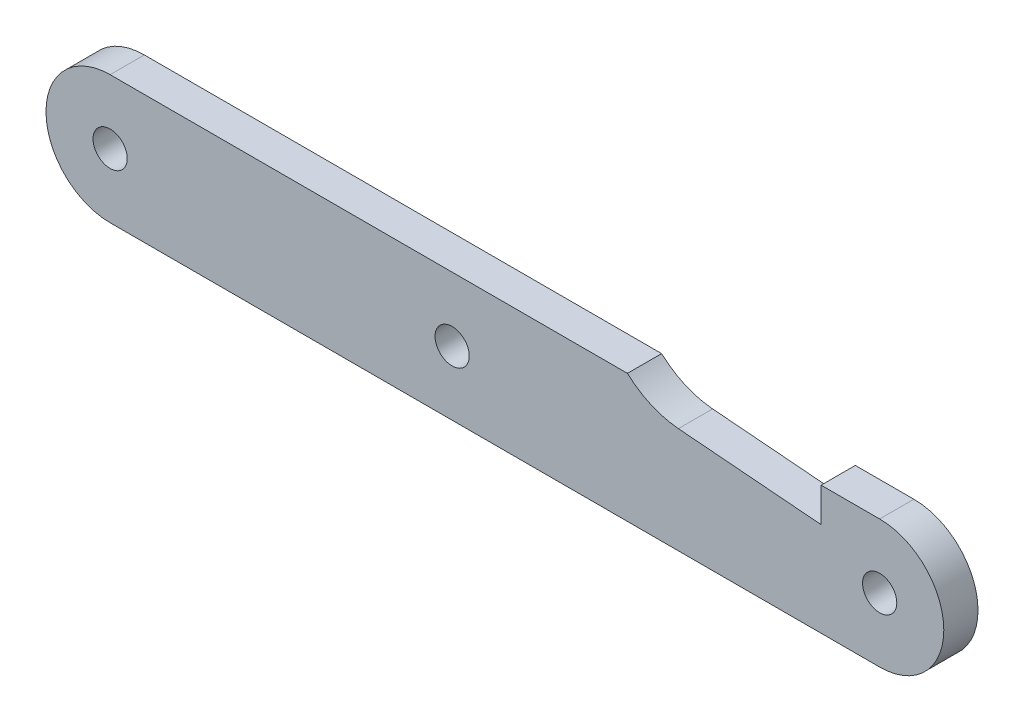
ISO-10303-21;
HEADER;
FILE_DESCRIPTION(('STEP AP214'),'2;1');
FILE_NAME('part.step','',(''),(''),'','','');
FILE_SCHEMA(('AUTOMOTIVE_DESIGN { 1 0 10303 214 1 1 1 1 }'));
ENDSEC;
DATA;
#1=APPLICATION_CONTEXT('core data for automotive mechanical design processes');
#2=APPLICATION_PROTOCOL_DEFINITION('international standard','automotive_design',2000,#1);
#3=PRODUCT_CONTEXT('',#1,'mechanical');
#4=PRODUCT('Part','Part','',(#3));
#5=PRODUCT_RELATED_PRODUCT_CATEGORY('part','',(#4));
#6=PRODUCT_DEFINITION_FORMATION('','',#4);
#7=PRODUCT_DEFINITION_CONTEXT('part definition',#1,'design');
#8=PRODUCT_DEFINITION('design','',#6,#7);
#9=PRODUCT_DEFINITION_SHAPE('','',#8);
#10=(LENGTH_UNIT() NAMED_UNIT(*) SI_UNIT(.MILLI.,.METRE.));
#11=(NAMED_UNIT(*) PLANE_ANGLE_UNIT() SI_UNIT($,.RADIAN.));
#12=(NAMED_UNIT(*) SI_UNIT($,.STERADIAN.) SOLID_ANGLE_UNIT());
#13=UNCERTAINTY_MEASURE_WITH_UNIT(LENGTH_MEASURE(1.E-05),#10,'distance_accuracy_value','');
#14=(GEOMETRIC_REPRESENTATION_CONTEXT(3) GLOBAL_UNCERTAINTY_ASSIGNED_CONTEXT((#13)) GLOBAL_UNIT_ASSIGNED_CONTEXT((#10,
#11,#12)) REPRESENTATION_CONTEXT('',''));
#15=CARTESIAN_POINT('',(0.,0.,0.));
#16=DIRECTION('',(0.,0.,1.));
#17=DIRECTION('',(1.,0.,0.));
#18=AXIS2_PLACEMENT_3D('',#15,#16,#17);
#19=CARTESIAN_POINT('',(0.,-7.5,4.));
#20=DIRECTION('',(0.,1.,0.));
#21=DIRECTION('',(0.,0.,1.));
#22=AXIS2_PLACEMENT_3D('',#19,#20,#21);
#23=PLANE('',#22);
#24=DIRECTION('',(1.,0.,0.));
#25=VECTOR('',#24,1.);
#26=CARTESIAN_POINT('',(0.,-7.5,0.));
#27=LINE('',#26,#25);
#28=CARTESIAN_POINT('',(0.,-7.5,0.));
#29=VERTEX_POINT('',#28);
#30=CARTESIAN_POINT('',(90.,-7.5,0.));
#31=VERTEX_POINT('',#30);
#32=EDGE_CURVE('E127',#29,#31,#27,.T.);
#33=ORIENTED_EDGE('',*,*,#32,.T.);
#34=DIRECTION('',(0.,0.,-1.));
#35=VECTOR('',#34,1.);
#36=CARTESIAN_POINT('',(90.,-7.5,4.));
#37=LINE('',#36,#35);
#38=CARTESIAN_POINT('',(90.,-7.5,4.));
#39=VERTEX_POINT('',#38);
#40=EDGE_CURVE('E107',#39,#31,#37,.T.);
#41=ORIENTED_EDGE('',*,*,#40,.F.);
#42=DIRECTION('',(1.,0.,0.));
#43=VECTOR('',#42,1.);
#44=CARTESIAN_POINT('',(0.,-7.5,4.));
#45=LINE('',#44,#43);
#46=CARTESIAN_POINT('',(0.,-7.5,4.));
#47=VERTEX_POINT('',#46);
#48=EDGE_CURVE('E114',#47,#39,#45,.T.);
#49=ORIENTED_EDGE('',*,*,#48,.F.);
#50=DIRECTION('',(0.,0.,-1.));
#51=VECTOR('',#50,1.);
#52=CARTESIAN_POINT('',(0.,-7.5,4.));
#53=LINE('',#52,#51);
#54=EDGE_CURVE('E141',#47,#29,#53,.T.);
#55=ORIENTED_EDGE('',*,*,#54,.T.);
#56=EDGE_LOOP('',(#33,#41,#49,#55));
#57=FACE_BOUND('',#56,.T.);
#58=ADVANCED_FACE('F37',(#57),#23,.F.);
#59=CARTESIAN_POINT('',(90.,0.,4.));
#60=DIRECTION('',(0.,0.,-1.));
#61=DIRECTION('',(-1.,0.,0.));
#62=AXIS2_PLACEMENT_3D('',#59,#60,#61);
#63=CYLINDRICAL_SURFACE('',#62,7.5);
#64=CARTESIAN_POINT('',(90.,0.,0.));
#65=DIRECTION('',(0.,0.,1.));
#66=DIRECTION('',(1.,0.,0.));
#67=AXIS2_PLACEMENT_3D('',#64,#65,#66);
#68=CIRCLE('',#67,7.5);
#69=CARTESIAN_POINT('',(90.,7.5,0.));
#70=VERTEX_POINT('',#69);
#71=EDGE_CURVE('E156',#31,#70,#68,.T.);
#72=ORIENTED_EDGE('',*,*,#71,.T.);
#73=DIRECTION('',(0.,0.,-1.));
#74=VECTOR('',#73,1.);
#75=CARTESIAN_POINT('',(90.,7.5,4.));
#76=LINE('',#75,#74);
#77=CARTESIAN_POINT('',(90.,7.5,4.));
#78=VERTEX_POINT('',#77);
#79=EDGE_CURVE('E109',#78,#70,#76,.T.);
#80=ORIENTED_EDGE('',*,*,#79,.F.);
#81=CARTESIAN_POINT('',(90.,0.,4.));
#82=DIRECTION('',(0.,0.,1.));
#83=DIRECTION('',(1.,0.,0.));
#84=AXIS2_PLACEMENT_3D('',#81,#82,#83);
#85=CIRCLE('',#84,7.5);
#86=EDGE_CURVE('E102',#39,#78,#85,.T.);
#87=ORIENTED_EDGE('',*,*,#86,.F.);
#88=ORIENTED_EDGE('',*,*,#40,.T.);
#89=EDGE_LOOP('',(#72,#80,#87,#88));
#90=FACE_BOUND('',#89,.T.);
#91=ADVANCED_FACE('F105',(#90),#63,.T.);
#92=CARTESIAN_POINT('',(0.,7.49999999999999,4.));
#93=DIRECTION('',(0.,1.,0.));
#94=DIRECTION('',(-1.,0.,0.));
#95=AXIS2_PLACEMENT_3D('',#92,#93,#94);
#96=PLANE('',#95);
#97=DIRECTION('',(1.,0.,0.));
#98=VECTOR('',#97,1.);
#99=CARTESIAN_POINT('',(0.,7.49999999999999,0.));
#100=LINE('',#99,#98);
#101=CARTESIAN_POINT('',(83.1517129679241,7.5,0.));
#102=VERTEX_POINT('',#101);
#103=EDGE_CURVE('E153',#102,#70,#100,.T.);
#104=ORIENTED_EDGE('',*,*,#103,.F.);
#105=DIRECTION('',(0.,0.,-1.));
#106=VECTOR('',#105,1.);
#107=CARTESIAN_POINT('',(83.1517129679241,7.5,4.));
#108=LINE('',#107,#106);
#109=CARTESIAN_POINT('',(83.1517129679241,7.5,4.));
#110=VERTEX_POINT('',#109);
#111=EDGE_CURVE('E130',#110,#102,#108,.T.);
#112=ORIENTED_EDGE('',*,*,#111,.F.);
#113=DIRECTION('',(1.,0.,0.));
#114=VECTOR('',#113,1.);
#115=CARTESIAN_POINT('',(0.,7.49999999999999,4.));
#116=LINE('',#115,#114);
#117=EDGE_CURVE('E113',#110,#78,#116,.T.);
#118=ORIENTED_EDGE('',*,*,#117,.T.);
#119=ORIENTED_EDGE('',*,*,#79,.T.);
#120=EDGE_LOOP('',(#104,#112,#118,#119));
#121=FACE_BOUND('',#120,.T.);
#122=ADVANCED_FACE('F214',(#121),#96,.T.);
#123=CARTESIAN_POINT('',(83.1517129679241,0.,4.));
#124=DIRECTION('',(-1.,0.,0.));
#125=DIRECTION('',(0.,0.,1.));
#126=AXIS2_PLACEMENT_3D('',#123,#124,#125);
#127=PLANE('',#126);
#128=DIRECTION('',(0.,1.,0.));
#129=VECTOR('',#128,1.);
#130=CARTESIAN_POINT('',(83.1517129679241,0.,0.));
#131=LINE('',#130,#129);
#132=CARTESIAN_POINT('',(83.1517129679241,3.5,0.));
#133=VERTEX_POINT('',#132);
#134=EDGE_CURVE('E150',#133,#102,#131,.T.);
#135=ORIENTED_EDGE('',*,*,#134,.F.);
#136=DIRECTION('',(0.,0.,-1.));
#137=VECTOR('',#136,1.);
#138=CARTESIAN_POINT('',(83.1517129679241,3.5,4.));
#139=LINE('',#138,#137);
#140=CARTESIAN_POINT('',(83.1517129679241,3.5,4.));
#141=VERTEX_POINT('',#140);
#142=EDGE_CURVE('E134',#141,#133,#139,.T.);
#143=ORIENTED_EDGE('',*,*,#142,.F.);
#144=DIRECTION('',(0.,1.,0.));
#145=VECTOR('',#144,1.);
#146=CARTESIAN_POINT('',(83.1517129679241,0.,4.));
#147=LINE('',#146,#145);
#148=EDGE_CURVE('E174',#141,#110,#147,.T.);
#149=ORIENTED_EDGE('',*,*,#148,.T.);
#150=ORIENTED_EDGE('',*,*,#111,.T.);
#151=EDGE_LOOP('',(#135,#143,#149,#150));
#152=FACE_BOUND('',#151,.T.);
#153=ADVANCED_FACE('F217',(#152),#127,.T.);
#154=CARTESIAN_POINT('',(0.852340949657427,10.3062623207952,4.));
#155=DIRECTION('',(-0.0824198916675559,-0.996597692881891,0.));
#156=DIRECTION('',(0.996597692881891,-0.0824198916675559,0.));
#157=AXIS2_PLACEMENT_3D('',#154,#155,#156);
#158=PLANE('',#157);
#159=DIRECTION('',(-0.996597692881891,0.0824198916675559,0.));
#160=VECTOR('',#159,1.);
#161=CARTESIAN_POINT('',(0.852340949657427,10.3062623207952,0.));
#162=LINE('',#161,#160);
#163=CARTESIAN_POINT('',(66.4604057005963,4.88039225515856,0.));
#164=VERTEX_POINT('',#163);
#165=EDGE_CURVE('E148',#133,#164,#162,.T.);
#166=ORIENTED_EDGE('',*,*,#165,.T.);
#167=DIRECTION('',(0.,0.,-1.));
#168=VECTOR('',#167,1.);
#169=CARTESIAN_POINT('',(66.4604057005963,4.88039225515856,4.));
#170=LINE('',#169,#168);
#171=CARTESIAN_POINT('',(66.4604057005963,4.88039225515856,4.));
#172=VERTEX_POINT('',#171);
#173=EDGE_CURVE('E52',#164,#172,#170,.F.);
#174=ORIENTED_EDGE('',*,*,#173,.T.);
#175=DIRECTION('',(-0.996597692881891,0.0824198916675559,0.));
#176=VECTOR('',#175,1.);
#177=CARTESIAN_POINT('',(0.852340949657427,10.3062623207952,4.));
#178=LINE('',#177,#176);
#179=EDGE_CURVE('E172',#141,#172,#178,.T.);
#180=ORIENTED_EDGE('',*,*,#179,.F.);
#181=ORIENTED_EDGE('',*,*,#142,.T.);
#182=EDGE_LOOP('',(#166,#174,#180,#181));
#183=FACE_BOUND('',#182,.T.);
#184=ADVANCED_FACE('F218',(#183),#158,.F.);
#185=CARTESIAN_POINT('',(0.,7.5,4.));
#186=DIRECTION('',(0.,1.,0.));
#187=DIRECTION('',(0.,0.,1.));
#188=AXIS2_PLACEMENT_3D('',#185,#186,#187);
#189=PLANE('',#188);
#190=DIRECTION('',(1.,0.,0.));
#191=VECTOR('',#190,1.);
#192=CARTESIAN_POINT('',(0.,7.5,0.));
#193=LINE('',#192,#191);
#194=CARTESIAN_POINT('',(0.,7.5,0.));
#195=VERTEX_POINT('',#194);
#196=CARTESIAN_POINT('',(60.5,7.5,0.));
#197=VERTEX_POINT('',#196);
#198=EDGE_CURVE('E146',#195,#197,#193,.T.);
#199=ORIENTED_EDGE('',*,*,#198,.F.);
#200=DIRECTION('',(0.,0.,-1.));
#201=VECTOR('',#200,1.);
#202=CARTESIAN_POINT('',(0.,7.5,4.));
#203=LINE('',#202,#201);
#204=CARTESIAN_POINT('',(0.,7.5,4.));
#205=VERTEX_POINT('',#204);
#206=EDGE_CURVE('E139',#205,#195,#203,.T.);
#207=ORIENTED_EDGE('',*,*,#206,.F.);
#208=DIRECTION('',(1.,0.,0.));
#209=VECTOR('',#208,1.);
#210=CARTESIAN_POINT('',(0.,7.5,4.));
#211=LINE('',#210,#209);
#212=CARTESIAN_POINT('',(60.5,7.5,4.));
#213=VERTEX_POINT('',#212);
#214=EDGE_CURVE('E169',#205,#213,#211,.T.);
#215=ORIENTED_EDGE('',*,*,#214,.T.);
#216=DIRECTION('',(0.,0.,-1.));
#217=VECTOR('',#216,1.);
#218=CARTESIAN_POINT('',(60.5,7.5,4.));
#219=LINE('',#218,#217);
#220=EDGE_CURVE('E136',#213,#197,#219,.T.);
#221=ORIENTED_EDGE('',*,*,#220,.T.);
#222=EDGE_LOOP('',(#199,#207,#215,#221));
#223=FACE_BOUND('',#222,.T.);
#224=ADVANCED_FACE('F202',(#223),#189,.T.);
#225=CARTESIAN_POINT('',(0.,0.,4.));
#226=DIRECTION('',(0.,0.,-1.));
#227=DIRECTION('',(-1.,0.,0.));
#228=AXIS2_PLACEMENT_3D('',#225,#226,#227);
#229=CYLINDRICAL_SURFACE('',#228,2.);
#230=CARTESIAN_POINT('',(0.,0.,4.));
#231=DIRECTION('',(0.,0.,1.));
#232=DIRECTION('',(1.,0.,0.));
#233=AXIS2_PLACEMENT_3D('',#230,#231,#232);
#234=CIRCLE('',#233,2.);
#235=CARTESIAN_POINT('',(2.,0.,4.));
#236=VERTEX_POINT('',#235);
#237=EDGE_CURVE('E124',#236,#236,#234,.T.);
#238=ORIENTED_EDGE('',*,*,#237,.T.);
#239=EDGE_LOOP('',(#238));
#240=FACE_BOUND('',#239,.T.);
#241=CARTESIAN_POINT('',(0.,0.,0.));
#242=DIRECTION('',(0.,0.,1.));
#243=DIRECTION('',(1.,0.,0.));
#244=AXIS2_PLACEMENT_3D('',#241,#242,#243);
#245=CIRCLE('',#244,2.);
#246=CARTESIAN_POINT('',(2.,0.,0.));
#247=VERTEX_POINT('',#246);
#248=EDGE_CURVE('E159',#247,#247,#245,.T.);
#249=ORIENTED_EDGE('',*,*,#248,.F.);
#250=EDGE_LOOP('',(#249));
#251=FACE_BOUND('',#250,.T.);
#252=ADVANCED_FACE('F198',(#240,#251),#229,.F.);
#253=CARTESIAN_POINT('',(90.,0.,4.));
#254=DIRECTION('',(0.,0.,-1.));
#255=DIRECTION('',(-1.,0.,0.));
#256=AXIS2_PLACEMENT_3D('',#253,#254,#255);
#257=CYLINDRICAL_SURFACE('',#256,2.);
#258=CARTESIAN_POINT('',(90.,0.,4.));
#259=DIRECTION('',(0.,0.,1.));
#260=DIRECTION('',(1.,0.,0.));
#261=AXIS2_PLACEMENT_3D('',#258,#259,#260);
#262=CIRCLE('',#261,2.);
#263=CARTESIAN_POINT('',(92.,0.,4.));
#264=VERTEX_POINT('',#263);
#265=EDGE_CURVE('E180',#264,#264,#262,.T.);
#266=ORIENTED_EDGE('',*,*,#265,.T.);
#267=EDGE_LOOP('',(#266));
#268=FACE_BOUND('',#267,.T.);
#269=CARTESIAN_POINT('',(90.,0.,0.));
#270=DIRECTION('',(0.,0.,1.));
#271=DIRECTION('',(1.,0.,0.));
#272=AXIS2_PLACEMENT_3D('',#269,#270,#271);
#273=CIRCLE('',#272,2.);
#274=CARTESIAN_POINT('',(92.,0.,0.));
#275=VERTEX_POINT('',#274);
#276=EDGE_CURVE('E162',#275,#275,#273,.T.);
#277=ORIENTED_EDGE('',*,*,#276,.F.);
#278=EDGE_LOOP('',(#277));
#279=FACE_BOUND('',#278,.T.);
#280=ADVANCED_FACE('F201',(#268,#279),#257,.F.);
#281=CARTESIAN_POINT('',(40.,0.,4.));
#282=DIRECTION('',(0.,0.,-1.));
#283=DIRECTION('',(-1.,0.,0.));
#284=AXIS2_PLACEMENT_3D('',#281,#282,#283);
#285=CYLINDRICAL_SURFACE('',#284,2.);
#286=CARTESIAN_POINT('',(40.,0.,4.));
#287=DIRECTION('',(0.,0.,1.));
#288=DIRECTION('',(1.,0.,0.));
#289=AXIS2_PLACEMENT_3D('',#286,#287,#288);
#290=CIRCLE('',#289,2.);
#291=CARTESIAN_POINT('',(42.,0.,4.));
#292=VERTEX_POINT('',#291);
#293=EDGE_CURVE('E145',#292,#292,#290,.T.);
#294=ORIENTED_EDGE('',*,*,#293,.T.);
#295=EDGE_LOOP('',(#294));
#296=FACE_BOUND('',#295,.T.);
#297=CARTESIAN_POINT('',(40.,0.,0.));
#298=DIRECTION('',(0.,0.,1.));
#299=DIRECTION('',(1.,0.,0.));
#300=AXIS2_PLACEMENT_3D('',#297,#298,#299);
#301=CIRCLE('',#300,2.);
#302=CARTESIAN_POINT('',(42.,0.,0.));
#303=VERTEX_POINT('',#302);
#304=EDGE_CURVE('E165',#303,#303,#301,.T.);
#305=ORIENTED_EDGE('',*,*,#304,.F.);
#306=EDGE_LOOP('',(#305));
#307=FACE_BOUND('',#306,.T.);
#308=ADVANCED_FACE('F186',(#296,#307),#285,.F.);
#309=CARTESIAN_POINT('',(0.,0.,4.));
#310=DIRECTION('',(0.,0.,-1.));
#311=DIRECTION('',(-1.,0.,0.));
#312=AXIS2_PLACEMENT_3D('',#309,#310,#311);
#313=CYLINDRICAL_SURFACE('',#312,7.5);
#314=CARTESIAN_POINT('',(0.,0.,0.));
#315=DIRECTION('',(0.,0.,1.));
#316=DIRECTION('',(1.,0.,0.));
#317=AXIS2_PLACEMENT_3D('',#314,#315,#316);
#318=CIRCLE('',#317,7.5);
#319=EDGE_CURVE('E143',#195,#29,#318,.T.);
#320=ORIENTED_EDGE('',*,*,#319,.T.);
#321=ORIENTED_EDGE('',*,*,#54,.F.);
#322=CARTESIAN_POINT('',(0.,0.,4.));
#323=DIRECTION('',(0.,0.,1.));
#324=DIRECTION('',(1.,0.,0.));
#325=AXIS2_PLACEMENT_3D('',#322,#323,#324);
#326=CIRCLE('',#325,7.5);
#327=EDGE_CURVE('E120',#205,#47,#326,.T.);
#328=ORIENTED_EDGE('',*,*,#327,.F.);
#329=ORIENTED_EDGE('',*,*,#206,.T.);
#330=EDGE_LOOP('',(#320,#321,#328,#329));
#331=FACE_BOUND('',#330,.T.);
#332=ADVANCED_FACE('F192',(#331),#313,.T.);
#333=CARTESIAN_POINT('',(0.,0.,4.));
#334=DIRECTION('',(0.,0.,1.));
#335=DIRECTION('',(1.,0.,0.));
#336=AXIS2_PLACEMENT_3D('',#333,#334,#335);
#337=PLANE('',#336);
#338=ORIENTED_EDGE('',*,*,#293,.F.);
#339=EDGE_LOOP('',(#338));
#340=FACE_BOUND('',#339,.T.);
#341=ORIENTED_EDGE('',*,*,#265,.F.);
#342=EDGE_LOOP('',(#341));
#343=FACE_BOUND('',#342,.T.);
#344=ORIENTED_EDGE('',*,*,#237,.F.);
#345=EDGE_LOOP('',(#344));
#346=FACE_BOUND('',#345,.T.);
#347=ORIENTED_EDGE('',*,*,#48,.T.);
#348=ORIENTED_EDGE('',*,*,#86,.T.);
#349=ORIENTED_EDGE('',*,*,#117,.F.);
#350=ORIENTED_EDGE('',*,*,#148,.F.);
#351=ORIENTED_EDGE('',*,*,#179,.T.);
#352=CARTESIAN_POINT('',(67.2846046172718,14.8463691839775,4.));
#353=DIRECTION('',(0.,0.,1.));
#354=DIRECTION('',(1.,0.,0.));
#355=AXIS2_PLACEMENT_3D('',#352,#353,#354);
#356=CIRCLE('',#355,10.);
#357=EDGE_CURVE('E11',#172,#213,#356,.F.);
#358=ORIENTED_EDGE('',*,*,#357,.T.);
#359=ORIENTED_EDGE('',*,*,#214,.F.);
#360=ORIENTED_EDGE('',*,*,#327,.T.);
#361=EDGE_LOOP('',(#347,#348,#349,#350,#351,#358,#359,#360));
#362=FACE_BOUND('',#361,.T.);
#363=ADVANCED_FACE('F117',(#340,#343,#346,#362),#337,.T.);
#364=CARTESIAN_POINT('',(0.,0.,0.));
#365=DIRECTION('',(0.,0.,1.));
#366=DIRECTION('',(1.,0.,0.));
#367=AXIS2_PLACEMENT_3D('',#364,#365,#366);
#368=PLANE('',#367);
#369=ORIENTED_EDGE('',*,*,#304,.T.);
#370=EDGE_LOOP('',(#369));
#371=FACE_BOUND('',#370,.T.);
#372=ORIENTED_EDGE('',*,*,#276,.T.);
#373=EDGE_LOOP('',(#372));
#374=FACE_BOUND('',#373,.T.);
#375=ORIENTED_EDGE('',*,*,#248,.T.);
#376=EDGE_LOOP('',(#375));
#377=FACE_BOUND('',#376,.T.);
#378=ORIENTED_EDGE('',*,*,#32,.F.);
#379=ORIENTED_EDGE('',*,*,#319,.F.);
#380=ORIENTED_EDGE('',*,*,#198,.T.);
#381=CARTESIAN_POINT('',(67.2846046172718,14.8463691839775,0.));
#382=DIRECTION('',(0.,0.,1.));
#383=DIRECTION('',(1.,0.,0.));
#384=AXIS2_PLACEMENT_3D('',#381,#382,#383);
#385=CIRCLE('',#384,10.);
#386=EDGE_CURVE('E45',#197,#164,#385,.T.);
#387=ORIENTED_EDGE('',*,*,#386,.T.);
#388=ORIENTED_EDGE('',*,*,#165,.F.);
#389=ORIENTED_EDGE('',*,*,#134,.T.);
#390=ORIENTED_EDGE('',*,*,#103,.T.);
#391=ORIENTED_EDGE('',*,*,#71,.F.);
#392=EDGE_LOOP('',(#378,#379,#380,#387,#388,#389,#390,#391));
#393=FACE_BOUND('',#392,.T.);
#394=ADVANCED_FACE('F191',(#371,#374,#377,#393),#368,.F.);
#395=CARTESIAN_POINT('',(67.2846046172718,14.8463691839775,4.));
#396=DIRECTION('',(0.,0.,-1.));
#397=DIRECTION('',(-1.,0.,0.));
#398=AXIS2_PLACEMENT_3D('',#395,#396,#397);
#399=CYLINDRICAL_SURFACE('',#398,10.);
#400=ORIENTED_EDGE('',*,*,#357,.F.);
#401=ORIENTED_EDGE('',*,*,#173,.F.);
#402=ORIENTED_EDGE('',*,*,#386,.F.);
#403=ORIENTED_EDGE('',*,*,#220,.F.);
#404=EDGE_LOOP('',(#400,#401,#402,#403));
#405=FACE_BOUND('',#404,.T.);
#406=ADVANCED_FACE('F39',(#405),#399,.F.);
#407=CLOSED_SHELL('',(#58,#91,#122,#153,#184,#224,#252,#280,#308,#332,#363,#394,#406));
#408=MANIFOLD_SOLID_BREP('B2',#407);
#409=ADVANCED_BREP_SHAPE_REPRESENTATION('',(#18,#408),#14);
#410=SHAPE_DEFINITION_REPRESENTATION(#9,#409);
ENDSEC;
END-ISO-10303-21;
